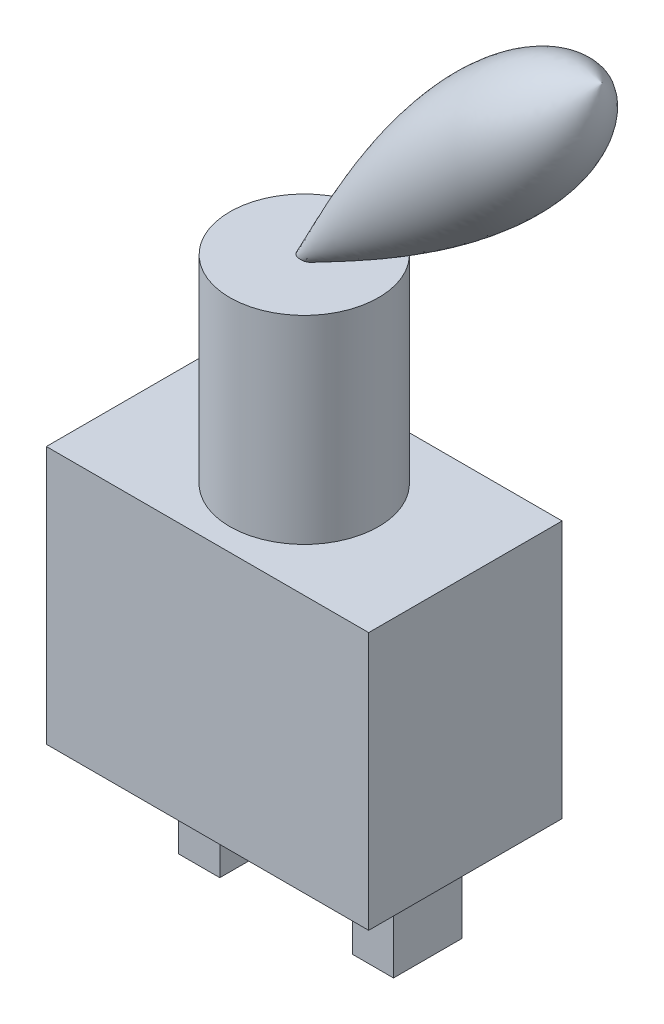
ISO-10303-21;
HEADER;
FILE_DESCRIPTION(('STEP AP214'),'2;1');
FILE_NAME('part.step','',(''),(''),'','','');
FILE_SCHEMA(('AUTOMOTIVE_DESIGN { 1 0 10303 214 1 1 1 1 }'));
ENDSEC;
DATA;
#1=APPLICATION_CONTEXT('core data for automotive mechanical design processes');
#2=APPLICATION_PROTOCOL_DEFINITION('international standard','automotive_design',2000,#1);
#3=PRODUCT_CONTEXT('',#1,'mechanical');
#4=PRODUCT('Part','Part','',(#3));
#5=PRODUCT_RELATED_PRODUCT_CATEGORY('part','',(#4));
#6=PRODUCT_DEFINITION_FORMATION('','',#4);
#7=PRODUCT_DEFINITION_CONTEXT('part definition',#1,'design');
#8=PRODUCT_DEFINITION('design','',#6,#7);
#9=PRODUCT_DEFINITION_SHAPE('','',#8);
#10=(LENGTH_UNIT() NAMED_UNIT(*) SI_UNIT(.MILLI.,.METRE.));
#11=(NAMED_UNIT(*) PLANE_ANGLE_UNIT() SI_UNIT($,.RADIAN.));
#12=(NAMED_UNIT(*) SI_UNIT($,.STERADIAN.) SOLID_ANGLE_UNIT());
#13=UNCERTAINTY_MEASURE_WITH_UNIT(LENGTH_MEASURE(1.E-05),#10,'distance_accuracy_value','');
#14=(GEOMETRIC_REPRESENTATION_CONTEXT(3) GLOBAL_UNCERTAINTY_ASSIGNED_CONTEXT((#13)) GLOBAL_UNIT_ASSIGNED_CONTEXT((#10,
#11,#12)) REPRESENTATION_CONTEXT('',''));
#15=CARTESIAN_POINT('',(0.,0.,0.));
#16=DIRECTION('',(0.,0.,1.));
#17=DIRECTION('',(1.,0.,0.));
#18=AXIS2_PLACEMENT_3D('',#15,#16,#17);
#19=CARTESIAN_POINT('',(-6.5,-5.2,3.9));
#20=DIRECTION('',(0.,1.,0.));
#21=DIRECTION('',(0.,0.,1.));
#22=AXIS2_PLACEMENT_3D('',#19,#20,#21);
#23=PLANE('',#22);
#24=DIRECTION('',(0.,0.,-1.));
#25=VECTOR('',#24,1.);
#26=CARTESIAN_POINT('',(-4.00967402725882,-5.2,-1.70043549954357));
#27=LINE('',#26,#25);
#28=CARTESIAN_POINT('',(-4.00967402725882,-5.2,1.06397609661713));
#29=VERTEX_POINT('',#28);
#30=CARTESIAN_POINT('',(-4.00967402725882,-5.2,-1.70043549954357));
#31=VERTEX_POINT('',#30);
#32=EDGE_CURVE('E154',#29,#31,#27,.T.);
#33=ORIENTED_EDGE('',*,*,#32,.F.);
#34=DIRECTION('',(-1.,0.,0.));
#35=VECTOR('',#34,1.);
#36=CARTESIAN_POINT('',(-2.33985509072454,-5.2,1.06397609661713));
#37=LINE('',#36,#35);
#38=CARTESIAN_POINT('',(-2.33985509072454,-5.2,1.06397609661713));
#39=VERTEX_POINT('',#38);
#40=EDGE_CURVE('E167',#39,#29,#37,.T.);
#41=ORIENTED_EDGE('',*,*,#40,.F.);
#42=DIRECTION('',(0.,0.,1.));
#43=VECTOR('',#42,1.);
#44=CARTESIAN_POINT('',(-2.33985509072454,-5.2,-1.70043549954357));
#45=LINE('',#44,#43);
#46=CARTESIAN_POINT('',(-2.33985509072454,-5.2,-1.70043549954357));
#47=VERTEX_POINT('',#46);
#48=EDGE_CURVE('E176',#47,#39,#45,.T.);
#49=ORIENTED_EDGE('',*,*,#48,.F.);
#50=DIRECTION('',(1.,0.,0.));
#51=VECTOR('',#50,1.);
#52=CARTESIAN_POINT('',(-2.33985509072454,-5.2,-1.70043549954357));
#53=LINE('',#52,#51);
#54=EDGE_CURVE('E157',#31,#47,#53,.T.);
#55=ORIENTED_EDGE('',*,*,#54,.F.);
#56=EDGE_LOOP('',(#33,#41,#49,#55));
#57=FACE_BOUND('',#56,.T.);
#58=DIRECTION('',(1.,0.,0.));
#59=VECTOR('',#58,1.);
#60=CARTESIAN_POINT('',(-6.5,-5.2,-3.9));
#61=LINE('',#60,#59);
#62=CARTESIAN_POINT('',(-6.5,-5.2,-3.9));
#63=VERTEX_POINT('',#62);
#64=CARTESIAN_POINT('',(6.5,-5.2,-3.9));
#65=VERTEX_POINT('',#64);
#66=EDGE_CURVE('E258',#63,#65,#61,.T.);
#67=ORIENTED_EDGE('',*,*,#66,.T.);
#68=DIRECTION('',(0.,0.,-1.));
#69=VECTOR('',#68,1.);
#70=CARTESIAN_POINT('',(6.5,-5.2,3.9));
#71=LINE('',#70,#69);
#72=CARTESIAN_POINT('',(6.5,-5.2,3.9));
#73=VERTEX_POINT('',#72);
#74=EDGE_CURVE('E264',#73,#65,#71,.T.);
#75=ORIENTED_EDGE('',*,*,#74,.F.);
#76=DIRECTION('',(1.,0.,0.));
#77=VECTOR('',#76,1.);
#78=CARTESIAN_POINT('',(-6.5,-5.2,3.9));
#79=LINE('',#78,#77);
#80=CARTESIAN_POINT('',(-6.5,-5.2,3.9));
#81=VERTEX_POINT('',#80);
#82=EDGE_CURVE('E267',#81,#73,#79,.T.);
#83=ORIENTED_EDGE('',*,*,#82,.F.);
#84=DIRECTION('',(0.,0.,-1.));
#85=VECTOR('',#84,1.);
#86=CARTESIAN_POINT('',(-6.5,-5.2,3.9));
#87=LINE('',#86,#85);
#88=EDGE_CURVE('E255',#81,#63,#87,.T.);
#89=ORIENTED_EDGE('',*,*,#88,.T.);
#90=EDGE_LOOP('',(#67,#75,#83,#89));
#91=FACE_BOUND('',#90,.T.);
#92=DIRECTION('',(0.,0.,-1.));
#93=VECTOR('',#92,1.);
#94=CARTESIAN_POINT('',(3.01624870888872,-5.2,-1.70043549954357));
#95=LINE('',#94,#93);
#96=CARTESIAN_POINT('',(3.01624870888872,-5.2,1.06397609661713));
#97=VERTEX_POINT('',#96);
#98=CARTESIAN_POINT('',(3.01624870888872,-5.2,-1.70043549954357));
#99=VERTEX_POINT('',#98);
#100=EDGE_CURVE('E153',#97,#99,#95,.T.);
#101=ORIENTED_EDGE('',*,*,#100,.F.);
#102=DIRECTION('',(-1.,0.,0.));
#103=VECTOR('',#102,1.);
#104=CARTESIAN_POINT('',(4.66515560555081,-5.2,1.06397609661713));
#105=LINE('',#104,#103);
#106=CARTESIAN_POINT('',(4.66515560555081,-5.2,1.06397609661713));
#107=VERTEX_POINT('',#106);
#108=EDGE_CURVE('E150',#107,#97,#105,.T.);
#109=ORIENTED_EDGE('',*,*,#108,.F.);
#110=DIRECTION('',(0.,0.,1.));
#111=VECTOR('',#110,1.);
#112=CARTESIAN_POINT('',(4.66515560555081,-5.2,-1.70043549954357));
#113=LINE('',#112,#111);
#114=CARTESIAN_POINT('',(4.66515560555081,-5.2,-1.70043549954357));
#115=VERTEX_POINT('',#114);
#116=EDGE_CURVE('E61',#115,#107,#113,.T.);
#117=ORIENTED_EDGE('',*,*,#116,.F.);
#118=DIRECTION('',(1.,0.,0.));
#119=VECTOR('',#118,1.);
#120=CARTESIAN_POINT('',(4.66515560555081,-5.2,-1.70043549954357));
#121=LINE('',#120,#119);
#122=EDGE_CURVE('E56',#99,#115,#121,.T.);
#123=ORIENTED_EDGE('',*,*,#122,.F.);
#124=EDGE_LOOP('',(#101,#109,#117,#123));
#125=FACE_BOUND('',#124,.T.);
#126=ADVANCED_FACE('F35',(#57,#91,#125),#23,.F.);
#127=CARTESIAN_POINT('',(0.,13.2,0.));
#128=DIRECTION('',(0.,1.,0.));
#129=DIRECTION('',(0.,0.,1.));
#130=AXIS2_PLACEMENT_3D('',#127,#128,#129);
#131=PLANE('',#130);
#132=CARTESIAN_POINT('',(0.,13.2,0.));
#133=DIRECTION('',(0.,1.,0.));
#134=DIRECTION('',(0.,0.,1.));
#135=AXIS2_PLACEMENT_3D('',#132,#133,#134);
#136=CIRCLE('',#135,3.);
#137=CARTESIAN_POINT('',(0.,13.2,3.));
#138=VERTEX_POINT('',#137);
#139=EDGE_CURVE('E196',#138,#138,#136,.T.);
#140=ORIENTED_EDGE('',*,*,#139,.T.);
#141=EDGE_LOOP('',(#140));
#142=FACE_BOUND('',#141,.T.);
#143=CARTESIAN_POINT('',(-2.89863077117258E-11,13.1999999999855,0.236074317083149));
#144=CARTESIAN_POINT('',(-0.0255510848401175,13.1999999999828,0.231098168149359));
#145=CARTESIAN_POINT('',(-0.0507395006386748,13.1999999999955,0.224142127190325));
#146=CARTESIAN_POINT('',(-0.0995398780865764,13.2000000000045,0.205876508994131));
#147=CARTESIAN_POINT('',(-0.123153194997474,13.2000000000009,0.194570732607454));
#148=CARTESIAN_POINT('',(-0.157530977011713,13.1999999999995,0.173149969176515));
#149=CARTESIAN_POINT('',(-0.169352755738714,13.1999999999999,0.164726907118127));
#150=CARTESIAN_POINT('',(-0.191662958252946,13.2000000000001,0.146237553978389));
#151=CARTESIAN_POINT('',(-0.202151749445967,13.2,0.136171717442925));
#152=CARTESIAN_POINT('',(-0.219371384614537,13.2,0.116490805362559));
#153=CARTESIAN_POINT('',(-0.22643626169327,13.2,0.107169852606247));
#154=CARTESIAN_POINT('',(-0.238949470616578,13.2,0.087517647737607));
#155=CARTESIAN_POINT('',(-0.244402627927718,13.2,0.0771895371176159));
#156=CARTESIAN_POINT('',(-0.252594566430599,13.2,0.057432175518631));
#157=CARTESIAN_POINT('',(-0.255629132332019,13.2,0.0481262309764399));
#158=CARTESIAN_POINT('',(-0.260087993620932,13.2,0.0291468468120192));
#159=CARTESIAN_POINT('',(-0.261515172225548,13.2,0.0194740974689147));
#160=CARTESIAN_POINT('',(-0.262655899560356,13.2,-2.01693616761487E-06));
#161=CARTESIAN_POINT('',(-0.262364536492137,13.2,-0.00980567640241465));
#162=CARTESIAN_POINT('',(-0.260086569665704,13.2,-0.0292094468449578));
#163=CARTESIAN_POINT('',(-0.25809951696851,13.2,-0.0388095032268419));
#164=CARTESIAN_POINT('',(-0.249955862354766,13.2,-0.0663597446829348));
#165=CARTESIAN_POINT('',(-0.241635985635509,13.2,-0.0836840450693594));
#166=CARTESIAN_POINT('',(-0.215998337742353,13.2,-0.122918997813577));
#167=CARTESIAN_POINT('',(-0.196293968086819,13.2,-0.143202106322375));
#168=CARTESIAN_POINT('',(-0.158694717320225,13.2,-0.172754718386334));
#169=CARTESIAN_POINT('',(-0.141862146224824,13.2,-0.183516800412396));
#170=CARTESIAN_POINT('',(-0.106693330475375,13.2,-0.202294894989741));
#171=CARTESIAN_POINT('',(-0.0883545947741155,13.2,-0.210306239956957));
#172=CARTESIAN_POINT('',(-0.0435999329308783,13.2,-0.226375750486087));
#173=CARTESIAN_POINT('',(-0.0167751066876735,13.2,-0.23328221670961));
#174=CARTESIAN_POINT('',(0.0376373709563635,13.2,-0.24270395770205));
#175=CARTESIAN_POINT('',(0.0652259469409958,13.2,-0.245213650473379));
#176=CARTESIAN_POINT('',(0.120955101144204,13.2,-0.245989353250974));
#177=CARTESIAN_POINT('',(0.149096745537104,13.2,-0.2441788466776));
#178=CARTESIAN_POINT('',(0.204712016486449,13.2,-0.2360462958926));
#179=CARTESIAN_POINT('',(0.232186478613143,13.2,-0.229730231526598));
#180=CARTESIAN_POINT('',(0.277538442406605,13.2,-0.214808226176876));
#181=CARTESIAN_POINT('',(0.295824393932859,13.2,-0.207455871153426));
#182=CARTESIAN_POINT('',(0.331070915278149,13.2,-0.190145230608497));
#183=CARTESIAN_POINT('',(0.348033487738036,13.2,-0.180190985848155));
#184=CARTESIAN_POINT('',(0.386987418147199,13.2,-0.152266130449389));
#185=CARTESIAN_POINT('',(0.407958259907466,13.2,-0.132691880062754));
#186=CARTESIAN_POINT('',(0.431225615466943,13.2,-0.101261326024854));
#187=CARTESIAN_POINT('',(0.437094609675416,13.2,-0.0920170153159214));
#188=CARTESIAN_POINT('',(0.447243822418903,13.2,-0.0727060040946675));
#189=CARTESIAN_POINT('',(0.451528154893878,13.2,-0.0626415170250631));
#190=CARTESIAN_POINT('',(0.458233633794813,13.2,-0.0417950252518216));
#191=CARTESIAN_POINT('',(0.460636928569336,13.2,-0.0310071762914759));
#192=CARTESIAN_POINT('',(0.463282219361715,13.2,-0.00916996661300381));
#193=CARTESIAN_POINT('',(0.463525753392158,13.2,0.00187920239036168));
#194=CARTESIAN_POINT('',(0.461943736192055,13.2,0.0223577636899599));
#195=CARTESIAN_POINT('',(0.460386028673018,13.2,0.0318091107108584));
#196=CARTESIAN_POINT('',(0.455746688332915,13.2,0.0503363912012077));
#197=CARTESIAN_POINT('',(0.452662964778622,13.2,0.0594117910621296));
#198=CARTESIAN_POINT('',(0.441209478109084,13.2,0.0862194358886243));
#199=CARTESIAN_POINT('',(0.43068857889332,13.2,0.103040987923069));
#200=CARTESIAN_POINT('',(0.398784425002438,13.2,0.142401386352732));
#201=CARTESIAN_POINT('',(0.374639106394844,13.2,0.162609158274106));
#202=CARTESIAN_POINT('',(0.32951757816481,13.2,0.191240008664708));
#203=CARTESIAN_POINT('',(0.30951373821474,13.1999999999999,0.201376783310556));
#204=CARTESIAN_POINT('',(0.268114606885067,13.2000000000001,0.218413847172426));
#205=CARTESIAN_POINT('',(0.246716323593801,13.2000000000003,0.225306897713376));
#206=CARTESIAN_POINT('',(0.196539783224784,13.1999999999995,0.237737566151075));
#207=CARTESIAN_POINT('',(0.167503967153825,13.1999999999981,0.242217851497781));
#208=CARTESIAN_POINT('',(0.109163113757676,13.2000000000019,0.246375361593773));
#209=CARTESIAN_POINT('',(0.0798588996876949,13.2000000000072,0.246064203277478));
#210=CARTESIAN_POINT('',(0.0337585311987413,13.1999999999958,0.241762328243017));
#211=CARTESIAN_POINT('',(0.0168008639715096,13.1999999999873,0.239346334772449));
#212=CARTESIAN_POINT('',(-2.89863077117258E-11,13.1999999999855,0.236074317083149));
#213=B_SPLINE_CURVE_WITH_KNOTS('',3,(#143,#144,#145,#146,#147,#148,#149,#150,#151,#152,#153,
#154,#155,#156,#157,#158,#159,#160,#161,#162,#163,#164,#165,#166,#167,#168,#169,#170,#171,#172,
#173,#174,#175,#176,#177,#178,#179,#180,#181,#182,#183,#184,#185,#186,#187,#188,#189,#190,#191,
#192,#193,#194,#195,#196,#197,#198,#199,#200,#201,#202,#203,#204,#205,#206,#207,#208,#209,#210,
#211,#212),.UNSPECIFIED.,.T.,.F.,(4,2,2,2,2,2,2,2,2,2,2,2,2,2,2,2,2,2,2,2,2,2,2,2,2,2,2,2,2,2,2,
2,2,2,4),(0.,0.0780478965885906,0.156027748326411,0.199456365161706,0.242872985867551,
0.27783252010704,0.312686300305522,0.341924202427817,0.371109575735082,0.400378404687085,
0.429654985055407,0.486428577428877,0.569671959316096,0.629390528251998,0.689209935483902,
0.77188564738501,0.854666245767632,0.938923851191341,1.02306983618875,1.08199726299892,
1.14083371310512,1.22525370506679,1.25798809280106,1.29063689219018,1.32359190392009,
1.35652344578348,1.38512497850047,1.41376580597088,1.47246504523937,1.56516015911086,
1.63220083603665,1.69939041925081,1.78710542740106,1.87460780261803,1.92592742782386),.UNSPECIFIED.);
#214=CARTESIAN_POINT('',(-2.89863077117258E-11,13.1999999999855,0.236074317083149));
#215=VERTEX_POINT('',#214);
#216=EDGE_CURVE('E39',#215,#215,#213,.T.);
#217=ORIENTED_EDGE('',*,*,#216,.T.);
#218=EDGE_LOOP('',(#217));
#219=FACE_BOUND('',#218,.T.);
#220=ADVANCED_FACE('F208',(#142,#219),#131,.T.);
#221=CARTESIAN_POINT('',(6.5,-5.2,3.9));
#222=DIRECTION('',(-1.,0.,0.));
#223=DIRECTION('',(0.,0.,1.));
#224=AXIS2_PLACEMENT_3D('',#221,#222,#223);
#225=PLANE('',#224);
#226=DIRECTION('',(0.,1.,0.));
#227=VECTOR('',#226,1.);
#228=CARTESIAN_POINT('',(6.5,-5.2,-3.9));
#229=LINE('',#228,#227);
#230=CARTESIAN_POINT('',(6.5,5.2,-3.9));
#231=VERTEX_POINT('',#230);
#232=EDGE_CURVE('E250',#65,#231,#229,.T.);
#233=ORIENTED_EDGE('',*,*,#232,.T.);
#234=DIRECTION('',(0.,0.,-1.));
#235=VECTOR('',#234,1.);
#236=CARTESIAN_POINT('',(6.5,5.2,3.9));
#237=LINE('',#236,#235);
#238=CARTESIAN_POINT('',(6.5,5.2,3.9));
#239=VERTEX_POINT('',#238);
#240=EDGE_CURVE('E48',#239,#231,#237,.T.);
#241=ORIENTED_EDGE('',*,*,#240,.F.);
#242=DIRECTION('',(0.,1.,0.));
#243=VECTOR('',#242,1.);
#244=CARTESIAN_POINT('',(6.5,-5.2,3.9));
#245=LINE('',#244,#243);
#246=EDGE_CURVE('E260',#73,#239,#245,.T.);
#247=ORIENTED_EDGE('',*,*,#246,.F.);
#248=ORIENTED_EDGE('',*,*,#74,.T.);
#249=EDGE_LOOP('',(#233,#241,#247,#248));
#250=FACE_BOUND('',#249,.T.);
#251=ADVANCED_FACE('F37',(#250),#225,.F.);
#252=CARTESIAN_POINT('',(-6.5,5.2,3.9));
#253=DIRECTION('',(0.,-1.,0.));
#254=DIRECTION('',(0.,0.,-1.));
#255=AXIS2_PLACEMENT_3D('',#252,#253,#254);
#256=PLANE('',#255);
#257=CARTESIAN_POINT('',(0.,5.2,0.));
#258=DIRECTION('',(0.,1.,0.));
#259=DIRECTION('',(0.,0.,1.));
#260=AXIS2_PLACEMENT_3D('',#257,#258,#259);
#261=CIRCLE('',#260,3.);
#262=CARTESIAN_POINT('',(0.,5.2,3.));
#263=VERTEX_POINT('',#262);
#264=EDGE_CURVE('E11',#263,#263,#261,.T.);
#265=ORIENTED_EDGE('',*,*,#264,.F.);
#266=EDGE_LOOP('',(#265));
#267=FACE_BOUND('',#266,.T.);
#268=DIRECTION('',(-1.,0.,0.));
#269=VECTOR('',#268,1.);
#270=CARTESIAN_POINT('',(-6.5,5.2,-3.9));
#271=LINE('',#270,#269);
#272=CARTESIAN_POINT('',(-6.5,5.2,-3.9));
#273=VERTEX_POINT('',#272);
#274=EDGE_CURVE('E241',#231,#273,#271,.T.);
#275=ORIENTED_EDGE('',*,*,#274,.T.);
#276=DIRECTION('',(0.,0.,-1.));
#277=VECTOR('',#276,1.);
#278=CARTESIAN_POINT('',(-6.5,5.2,3.9));
#279=LINE('',#278,#277);
#280=CARTESIAN_POINT('',(-6.5,5.2,3.9));
#281=VERTEX_POINT('',#280);
#282=EDGE_CURVE('E243',#281,#273,#279,.T.);
#283=ORIENTED_EDGE('',*,*,#282,.F.);
#284=DIRECTION('',(-1.,0.,0.));
#285=VECTOR('',#284,1.);
#286=CARTESIAN_POINT('',(-6.5,5.2,3.9));
#287=LINE('',#286,#285);
#288=EDGE_CURVE('E274',#239,#281,#287,.T.);
#289=ORIENTED_EDGE('',*,*,#288,.F.);
#290=ORIENTED_EDGE('',*,*,#240,.T.);
#291=EDGE_LOOP('',(#275,#283,#289,#290));
#292=FACE_BOUND('',#291,.T.);
#293=ADVANCED_FACE('F229',(#267,#292),#256,.F.);
#294=CARTESIAN_POINT('',(-6.5,-5.2,3.9));
#295=DIRECTION('',(1.,0.,0.));
#296=DIRECTION('',(0.,0.,-1.));
#297=AXIS2_PLACEMENT_3D('',#294,#295,#296);
#298=PLANE('',#297);
#299=DIRECTION('',(0.,-1.,0.));
#300=VECTOR('',#299,1.);
#301=CARTESIAN_POINT('',(-6.5,-5.2,-3.9));
#302=LINE('',#301,#300);
#303=EDGE_CURVE('E249',#273,#63,#302,.T.);
#304=ORIENTED_EDGE('',*,*,#303,.T.);
#305=ORIENTED_EDGE('',*,*,#88,.F.);
#306=DIRECTION('',(0.,-1.,0.));
#307=VECTOR('',#306,1.);
#308=CARTESIAN_POINT('',(-6.5,-5.2,3.9));
#309=LINE('',#308,#307);
#310=EDGE_CURVE('E254',#281,#81,#309,.T.);
#311=ORIENTED_EDGE('',*,*,#310,.F.);
#312=ORIENTED_EDGE('',*,*,#282,.T.);
#313=EDGE_LOOP('',(#304,#305,#311,#312));
#314=FACE_BOUND('',#313,.T.);
#315=ADVANCED_FACE('F220',(#314),#298,.F.);
#316=CARTESIAN_POINT('',(0.,0.,3.9));
#317=DIRECTION('',(0.,0.,-1.));
#318=DIRECTION('',(-1.,0.,0.));
#319=AXIS2_PLACEMENT_3D('',#316,#317,#318);
#320=PLANE('',#319);
#321=ORIENTED_EDGE('',*,*,#246,.T.);
#322=ORIENTED_EDGE('',*,*,#288,.T.);
#323=ORIENTED_EDGE('',*,*,#310,.T.);
#324=ORIENTED_EDGE('',*,*,#82,.T.);
#325=EDGE_LOOP('',(#321,#322,#323,#324));
#326=FACE_BOUND('',#325,.T.);
#327=ADVANCED_FACE('F217',(#326),#320,.F.);
#328=CARTESIAN_POINT('',(0.,0.,-3.9));
#329=DIRECTION('',(0.,0.,-1.));
#330=DIRECTION('',(-1.,0.,0.));
#331=AXIS2_PLACEMENT_3D('',#328,#329,#330);
#332=PLANE('',#331);
#333=ORIENTED_EDGE('',*,*,#232,.F.);
#334=ORIENTED_EDGE('',*,*,#66,.F.);
#335=ORIENTED_EDGE('',*,*,#303,.F.);
#336=ORIENTED_EDGE('',*,*,#274,.F.);
#337=EDGE_LOOP('',(#333,#334,#335,#336));
#338=FACE_BOUND('',#337,.T.);
#339=ADVANCED_FACE('F215',(#338),#332,.T.);
#340=CARTESIAN_POINT('',(0.,13.2,0.));
#341=DIRECTION('',(0.,-1.,0.));
#342=DIRECTION('',(0.,0.,-1.));
#343=AXIS2_PLACEMENT_3D('',#340,#341,#342);
#344=CYLINDRICAL_SURFACE('',#343,3.);
#345=ORIENTED_EDGE('',*,*,#139,.F.);
#346=EDGE_LOOP('',(#345));
#347=FACE_BOUND('',#346,.T.);
#348=ORIENTED_EDGE('',*,*,#264,.T.);
#349=EDGE_LOOP('',(#348));
#350=FACE_BOUND('',#349,.T.);
#351=ADVANCED_FACE('F205',(#347,#350),#344,.T.);
#352=CARTESIAN_POINT('',(11.9981271297881,25.1981271297881,0.));
#353=CARTESIAN_POINT('',(9.52536322436957,22.7253632243696,5.25748856680528));
#354=CARTESIAN_POINT('',(0.253760524723329,13.4537605247233,0.0593255725793514));
#355=CARTESIAN_POINT('',(-0.739961735019353,12.4600382649806,0.));
#356=B_SPLINE_CURVE_WITH_KNOTS('',3,(#352,#353,#354,#355),.UNSPECIFIED.,.F.,.F.,(4,4),(0.,1.),.UNSPECIFIED.);
#357=CARTESIAN_POINT('',(0.,13.2,0.));
#358=DIRECTION('',(-0.707106781186548,-0.707106781186547,0.));
#359=AXIS1_PLACEMENT('',#357,#358);
#360=SURFACE_OF_REVOLUTION('',#356,#359);
#361=ORIENTED_EDGE('',*,*,#216,.F.);
#362=EDGE_LOOP('',(#361));
#363=FACE_BOUND('',#362,.T.);
#364=CARTESIAN_POINT('',(11.9981271297881,25.1981271297881,0.));
#365=VERTEX_POINT('',#364);
#366=VERTEX_LOOP('',#365);
#367=FACE_BOUND('',#366,.T.);
#368=ADVANCED_FACE('F200',(#363,#367),#360,.T.);
#369=CARTESIAN_POINT('',(-4.00967402725882,-9.2,-1.70043549954357));
#370=DIRECTION('',(1.,0.,0.));
#371=DIRECTION('',(0.,0.,-1.));
#372=AXIS2_PLACEMENT_3D('',#369,#370,#371);
#373=PLANE('',#372);
#374=ORIENTED_EDGE('',*,*,#32,.T.);
#375=DIRECTION('',(0.,1.,0.));
#376=VECTOR('',#375,1.);
#377=CARTESIAN_POINT('',(-4.00967402725882,-9.2,-1.70043549954357));
#378=LINE('',#377,#376);
#379=CARTESIAN_POINT('',(-4.00967402725882,-9.2,-1.70043549954357));
#380=VERTEX_POINT('',#379);
#381=EDGE_CURVE('E189',#380,#31,#378,.T.);
#382=ORIENTED_EDGE('',*,*,#381,.F.);
#383=DIRECTION('',(0.,0.,-1.));
#384=VECTOR('',#383,1.);
#385=CARTESIAN_POINT('',(-4.00967402725882,-9.2,-1.70043549954357));
#386=LINE('',#385,#384);
#387=CARTESIAN_POINT('',(-4.00967402725882,-9.2,1.06397609661713));
#388=VERTEX_POINT('',#387);
#389=EDGE_CURVE('E163',#388,#380,#386,.T.);
#390=ORIENTED_EDGE('',*,*,#389,.F.);
#391=DIRECTION('',(0.,1.,0.));
#392=VECTOR('',#391,1.);
#393=CARTESIAN_POINT('',(-4.00967402725882,-9.2,1.06397609661713));
#394=LINE('',#393,#392);
#395=EDGE_CURVE('E172',#388,#29,#394,.T.);
#396=ORIENTED_EDGE('',*,*,#395,.T.);
#397=EDGE_LOOP('',(#374,#382,#390,#396));
#398=FACE_BOUND('',#397,.T.);
#399=ADVANCED_FACE('F204',(#398),#373,.F.);
#400=CARTESIAN_POINT('',(-2.33985509072454,-9.2,-1.70043549954357));
#401=DIRECTION('',(0.,0.,1.));
#402=DIRECTION('',(1.,0.,0.));
#403=AXIS2_PLACEMENT_3D('',#400,#401,#402);
#404=PLANE('',#403);
#405=ORIENTED_EDGE('',*,*,#54,.T.);
#406=DIRECTION('',(0.,1.,0.));
#407=VECTOR('',#406,1.);
#408=CARTESIAN_POINT('',(-2.33985509072454,-9.2,-1.70043549954357));
#409=LINE('',#408,#407);
#410=CARTESIAN_POINT('',(-2.33985509072454,-9.2,-1.70043549954357));
#411=VERTEX_POINT('',#410);
#412=EDGE_CURVE('E186',#411,#47,#409,.T.);
#413=ORIENTED_EDGE('',*,*,#412,.F.);
#414=DIRECTION('',(1.,0.,0.));
#415=VECTOR('',#414,1.);
#416=CARTESIAN_POINT('',(-2.33985509072454,-9.2,-1.70043549954357));
#417=LINE('',#416,#415);
#418=EDGE_CURVE('E166',#380,#411,#417,.T.);
#419=ORIENTED_EDGE('',*,*,#418,.F.);
#420=ORIENTED_EDGE('',*,*,#381,.T.);
#421=EDGE_LOOP('',(#405,#413,#419,#420));
#422=FACE_BOUND('',#421,.T.);
#423=ADVANCED_FACE('F322',(#422),#404,.F.);
#424=CARTESIAN_POINT('',(-2.33985509072454,-9.2,-1.70043549954357));
#425=DIRECTION('',(-1.,0.,0.));
#426=DIRECTION('',(0.,0.,1.));
#427=AXIS2_PLACEMENT_3D('',#424,#425,#426);
#428=PLANE('',#427);
#429=ORIENTED_EDGE('',*,*,#48,.T.);
#430=DIRECTION('',(0.,1.,0.));
#431=VECTOR('',#430,1.);
#432=CARTESIAN_POINT('',(-2.33985509072454,-9.2,1.06397609661713));
#433=LINE('',#432,#431);
#434=CARTESIAN_POINT('',(-2.33985509072454,-9.2,1.06397609661713));
#435=VERTEX_POINT('',#434);
#436=EDGE_CURVE('E183',#435,#39,#433,.T.);
#437=ORIENTED_EDGE('',*,*,#436,.F.);
#438=DIRECTION('',(0.,0.,1.));
#439=VECTOR('',#438,1.);
#440=CARTESIAN_POINT('',(-2.33985509072454,-9.2,-1.70043549954357));
#441=LINE('',#440,#439);
#442=EDGE_CURVE('E169',#411,#435,#441,.T.);
#443=ORIENTED_EDGE('',*,*,#442,.F.);
#444=ORIENTED_EDGE('',*,*,#412,.T.);
#445=EDGE_LOOP('',(#429,#437,#443,#444));
#446=FACE_BOUND('',#445,.T.);
#447=ADVANCED_FACE('F319',(#446),#428,.F.);
#448=CARTESIAN_POINT('',(-2.33985509072454,-9.2,1.06397609661713));
#449=DIRECTION('',(0.,0.,-1.));
#450=DIRECTION('',(-1.,0.,0.));
#451=AXIS2_PLACEMENT_3D('',#448,#449,#450);
#452=PLANE('',#451);
#453=ORIENTED_EDGE('',*,*,#40,.T.);
#454=ORIENTED_EDGE('',*,*,#395,.F.);
#455=DIRECTION('',(-1.,0.,0.));
#456=VECTOR('',#455,1.);
#457=CARTESIAN_POINT('',(-2.33985509072454,-9.2,1.06397609661713));
#458=LINE('',#457,#456);
#459=EDGE_CURVE('E171',#435,#388,#458,.T.);
#460=ORIENTED_EDGE('',*,*,#459,.F.);
#461=ORIENTED_EDGE('',*,*,#436,.T.);
#462=EDGE_LOOP('',(#453,#454,#460,#461));
#463=FACE_BOUND('',#462,.T.);
#464=ADVANCED_FACE('F315',(#463),#452,.F.);
#465=CARTESIAN_POINT('',(0.,-9.2,0.));
#466=DIRECTION('',(0.,-1.,0.));
#467=DIRECTION('',(0.,0.,-1.));
#468=AXIS2_PLACEMENT_3D('',#465,#466,#467);
#469=PLANE('',#468);
#470=ORIENTED_EDGE('',*,*,#389,.T.);
#471=ORIENTED_EDGE('',*,*,#418,.T.);
#472=ORIENTED_EDGE('',*,*,#442,.T.);
#473=ORIENTED_EDGE('',*,*,#459,.T.);
#474=EDGE_LOOP('',(#470,#471,#472,#473));
#475=FACE_BOUND('',#474,.T.);
#476=ADVANCED_FACE('F312',(#475),#469,.T.);
#477=CARTESIAN_POINT('',(3.01624870888872,-9.2,-1.70043549954357));
#478=DIRECTION('',(1.,0.,0.));
#479=DIRECTION('',(0.,0.,-1.));
#480=AXIS2_PLACEMENT_3D('',#477,#478,#479);
#481=PLANE('',#480);
#482=ORIENTED_EDGE('',*,*,#100,.T.);
#483=DIRECTION('',(0.,1.,0.));
#484=VECTOR('',#483,1.);
#485=CARTESIAN_POINT('',(3.01624870888872,-9.2,-1.70043549954357));
#486=LINE('',#485,#484);
#487=CARTESIAN_POINT('',(3.01624870888872,-9.2,-1.70043549954357));
#488=VERTEX_POINT('',#487);
#489=EDGE_CURVE('E134',#488,#99,#486,.T.);
#490=ORIENTED_EDGE('',*,*,#489,.F.);
#491=DIRECTION('',(0.,0.,-1.));
#492=VECTOR('',#491,1.);
#493=CARTESIAN_POINT('',(3.01624870888872,-9.2,-1.70043549954357));
#494=LINE('',#493,#492);
#495=CARTESIAN_POINT('',(3.01624870888872,-9.2,1.06397609661713));
#496=VERTEX_POINT('',#495);
#497=EDGE_CURVE('E141',#496,#488,#494,.T.);
#498=ORIENTED_EDGE('',*,*,#497,.F.);
#499=DIRECTION('',(0.,1.,0.));
#500=VECTOR('',#499,1.);
#501=CARTESIAN_POINT('',(3.01624870888872,-9.2,1.06397609661713));
#502=LINE('',#501,#500);
#503=EDGE_CURVE('E290',#496,#97,#502,.T.);
#504=ORIENTED_EDGE('',*,*,#503,.T.);
#505=EDGE_LOOP('',(#482,#490,#498,#504));
#506=FACE_BOUND('',#505,.T.);
#507=ADVANCED_FACE('F152',(#506),#481,.F.);
#508=CARTESIAN_POINT('',(4.66515560555081,-9.2,-1.70043549954357));
#509=DIRECTION('',(0.,0.,1.));
#510=DIRECTION('',(1.,0.,0.));
#511=AXIS2_PLACEMENT_3D('',#508,#509,#510);
#512=PLANE('',#511);
#513=ORIENTED_EDGE('',*,*,#122,.T.);
#514=DIRECTION('',(0.,1.,0.));
#515=VECTOR('',#514,1.);
#516=CARTESIAN_POINT('',(4.66515560555081,-9.2,-1.70043549954357));
#517=LINE('',#516,#515);
#518=CARTESIAN_POINT('',(4.66515560555081,-9.2,-1.70043549954357));
#519=VERTEX_POINT('',#518);
#520=EDGE_CURVE('E137',#519,#115,#517,.T.);
#521=ORIENTED_EDGE('',*,*,#520,.F.);
#522=DIRECTION('',(1.,0.,0.));
#523=VECTOR('',#522,1.);
#524=CARTESIAN_POINT('',(4.66515560555081,-9.2,-1.70043549954357));
#525=LINE('',#524,#523);
#526=EDGE_CURVE('E130',#488,#519,#525,.T.);
#527=ORIENTED_EDGE('',*,*,#526,.F.);
#528=ORIENTED_EDGE('',*,*,#489,.T.);
#529=EDGE_LOOP('',(#513,#521,#527,#528));
#530=FACE_BOUND('',#529,.T.);
#531=ADVANCED_FACE('F132',(#530),#512,.F.);
#532=CARTESIAN_POINT('',(4.66515560555081,-9.2,-1.70043549954357));
#533=DIRECTION('',(-1.,0.,0.));
#534=DIRECTION('',(0.,0.,1.));
#535=AXIS2_PLACEMENT_3D('',#532,#533,#534);
#536=PLANE('',#535);
#537=ORIENTED_EDGE('',*,*,#116,.T.);
#538=DIRECTION('',(0.,1.,0.));
#539=VECTOR('',#538,1.);
#540=CARTESIAN_POINT('',(4.66515560555081,-9.2,1.06397609661713));
#541=LINE('',#540,#539);
#542=CARTESIAN_POINT('',(4.66515560555081,-9.2,1.06397609661713));
#543=VERTEX_POINT('',#542);
#544=EDGE_CURVE('E159',#543,#107,#541,.T.);
#545=ORIENTED_EDGE('',*,*,#544,.F.);
#546=DIRECTION('',(0.,0.,1.));
#547=VECTOR('',#546,1.);
#548=CARTESIAN_POINT('',(4.66515560555081,-9.2,-1.70043549954357));
#549=LINE('',#548,#547);
#550=EDGE_CURVE('E140',#519,#543,#549,.T.);
#551=ORIENTED_EDGE('',*,*,#550,.F.);
#552=ORIENTED_EDGE('',*,*,#520,.T.);
#553=EDGE_LOOP('',(#537,#545,#551,#552));
#554=FACE_BOUND('',#553,.T.);
#555=ADVANCED_FACE('F299',(#554),#536,.F.);
#556=CARTESIAN_POINT('',(4.66515560555081,-9.2,1.06397609661713));
#557=DIRECTION('',(0.,0.,-1.));
#558=DIRECTION('',(-1.,0.,0.));
#559=AXIS2_PLACEMENT_3D('',#556,#557,#558);
#560=PLANE('',#559);
#561=ORIENTED_EDGE('',*,*,#108,.T.);
#562=ORIENTED_EDGE('',*,*,#503,.F.);
#563=DIRECTION('',(-1.,0.,0.));
#564=VECTOR('',#563,1.);
#565=CARTESIAN_POINT('',(4.66515560555081,-9.2,1.06397609661713));
#566=LINE('',#565,#564);
#567=EDGE_CURVE('E146',#543,#496,#566,.T.);
#568=ORIENTED_EDGE('',*,*,#567,.F.);
#569=ORIENTED_EDGE('',*,*,#544,.T.);
#570=EDGE_LOOP('',(#561,#562,#568,#569));
#571=FACE_BOUND('',#570,.T.);
#572=ADVANCED_FACE('F289',(#571),#560,.F.);
#573=CARTESIAN_POINT('',(0.,-9.2,0.));
#574=DIRECTION('',(0.,-1.,0.));
#575=DIRECTION('',(0.,0.,-1.));
#576=AXIS2_PLACEMENT_3D('',#573,#574,#575);
#577=PLANE('',#576);
#578=ORIENTED_EDGE('',*,*,#497,.T.);
#579=ORIENTED_EDGE('',*,*,#526,.T.);
#580=ORIENTED_EDGE('',*,*,#550,.T.);
#581=ORIENTED_EDGE('',*,*,#567,.T.);
#582=EDGE_LOOP('',(#578,#579,#580,#581));
#583=FACE_BOUND('',#582,.T.);
#584=ADVANCED_FACE('F144',(#583),#577,.T.);
#585=CLOSED_SHELL('',(#126,#220,#251,#293,#315,#327,#339,#351,#368,#399,#423,#447,#464,#476,
#507,#531,#555,#572,#584));
#586=MANIFOLD_SOLID_BREP('B2',#585);
#587=ADVANCED_BREP_SHAPE_REPRESENTATION('',(#18,#586),#14);
#588=SHAPE_DEFINITION_REPRESENTATION(#9,#587);
ENDSEC;
END-ISO-10303-21;
